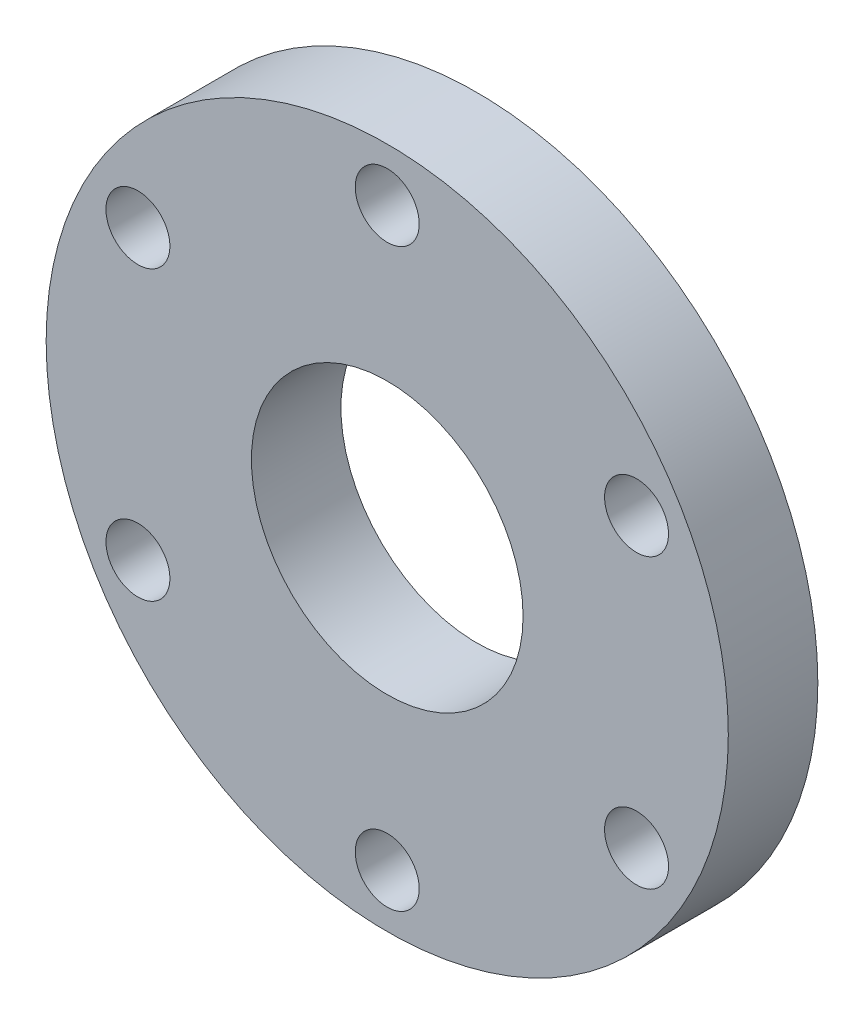
ISO-10303-21;
HEADER;
FILE_DESCRIPTION(('STEP AP214'),'2;1');
FILE_NAME('part.step','',(''),(''),'','','');
FILE_SCHEMA(('AUTOMOTIVE_DESIGN { 1 0 10303 214 1 1 1 1 }'));
ENDSEC;
DATA;
#1=APPLICATION_CONTEXT('core data for automotive mechanical design processes');
#2=APPLICATION_PROTOCOL_DEFINITION('international standard','automotive_design',2000,#1);
#3=PRODUCT_CONTEXT('',#1,'mechanical');
#4=PRODUCT('Part','Part','',(#3));
#5=PRODUCT_RELATED_PRODUCT_CATEGORY('part','',(#4));
#6=PRODUCT_DEFINITION_FORMATION('','',#4);
#7=PRODUCT_DEFINITION_CONTEXT('part definition',#1,'design');
#8=PRODUCT_DEFINITION('design','',#6,#7);
#9=PRODUCT_DEFINITION_SHAPE('','',#8);
#10=(LENGTH_UNIT() NAMED_UNIT(*) SI_UNIT(.MILLI.,.METRE.));
#11=(NAMED_UNIT(*) PLANE_ANGLE_UNIT() SI_UNIT($,.RADIAN.));
#12=(NAMED_UNIT(*) SI_UNIT($,.STERADIAN.) SOLID_ANGLE_UNIT());
#13=UNCERTAINTY_MEASURE_WITH_UNIT(LENGTH_MEASURE(1.E-05),#10,'distance_accuracy_value','');
#14=(GEOMETRIC_REPRESENTATION_CONTEXT(3) GLOBAL_UNCERTAINTY_ASSIGNED_CONTEXT((#13)) GLOBAL_UNIT_ASSIGNED_CONTEXT((#10,
#11,#12)) REPRESENTATION_CONTEXT('',''));
#15=CARTESIAN_POINT('',(0.,0.,0.));
#16=DIRECTION('',(0.,0.,1.));
#17=DIRECTION('',(1.,0.,0.));
#18=AXIS2_PLACEMENT_3D('',#15,#16,#17);
#19=CARTESIAN_POINT('',(0.,0.,6.6675));
#20=DIRECTION('',(0.,0.,-1.));
#21=DIRECTION('',(-1.,0.,0.));
#22=AXIS2_PLACEMENT_3D('',#19,#20,#21);
#23=CYLINDRICAL_SURFACE('',#22,50.8);
#24=CARTESIAN_POINT('',(0.,0.,6.6675));
#25=DIRECTION('',(0.,0.,1.));
#26=DIRECTION('',(1.,0.,0.));
#27=AXIS2_PLACEMENT_3D('',#24,#25,#26);
#28=CIRCLE('',#27,50.8);
#29=CARTESIAN_POINT('',(50.8,0.,6.6675));
#30=VERTEX_POINT('',#29);
#31=EDGE_CURVE('E10',#30,#30,#28,.T.);
#32=ORIENTED_EDGE('',*,*,#31,.F.);
#33=EDGE_LOOP('',(#32));
#34=FACE_BOUND('',#33,.T.);
#35=CARTESIAN_POINT('',(0.,0.,-6.6675));
#36=DIRECTION('',(0.,0.,1.));
#37=DIRECTION('',(1.,0.,0.));
#38=AXIS2_PLACEMENT_3D('',#35,#36,#37);
#39=CIRCLE('',#38,50.8);
#40=CARTESIAN_POINT('',(50.8,0.,-6.6675));
#41=VERTEX_POINT('',#40);
#42=EDGE_CURVE('E43',#41,#41,#39,.T.);
#43=ORIENTED_EDGE('',*,*,#42,.T.);
#44=EDGE_LOOP('',(#43));
#45=FACE_BOUND('',#44,.T.);
#46=ADVANCED_FACE('F40',(#34,#45),#23,.T.);
#47=CARTESIAN_POINT('',(0.,0.,6.6675));
#48=DIRECTION('',(0.,0.,1.));
#49=DIRECTION('',(1.,0.,0.));
#50=AXIS2_PLACEMENT_3D('',#47,#48,#49);
#51=PLANE('',#50);
#52=CARTESIAN_POINT('',(37.1310123923383,21.4376000000004,6.6675));
#53=DIRECTION('',(0.,0.,1.));
#54=DIRECTION('',(0.50000000000001,-0.866025403784433,0.));
#55=AXIS2_PLACEMENT_3D('',#52,#53,#54);
#56=CIRCLE('',#55,4.7625);
#57=CARTESIAN_POINT('',(39.5122623923384,17.3131540144771,6.6675));
#58=VERTEX_POINT('',#57);
#59=EDGE_CURVE('E78',#58,#58,#56,.T.);
#60=ORIENTED_EDGE('',*,*,#59,.F.);
#61=EDGE_LOOP('',(#60));
#62=FACE_BOUND('',#61,.T.);
#63=CARTESIAN_POINT('',(37.1310123923388,-21.4375999999997,6.6675));
#64=DIRECTION('',(0.,0.,1.));
#65=DIRECTION('',(-0.499999999999992,-0.866025403784443,0.));
#66=AXIS2_PLACEMENT_3D('',#63,#64,#65);
#67=CIRCLE('',#66,4.7625);
#68=CARTESIAN_POINT('',(34.7497623923388,-25.5620459855231,6.6675));
#69=VERTEX_POINT('',#68);
#70=EDGE_CURVE('E86',#69,#69,#67,.T.);
#71=ORIENTED_EDGE('',*,*,#70,.F.);
#72=EDGE_LOOP('',(#71));
#73=FACE_BOUND('',#72,.T.);
#74=CARTESIAN_POINT('',(0.,-42.8752,6.6675));
#75=DIRECTION('',(0.,0.,1.));
#76=DIRECTION('',(-1.,0.,0.));
#77=AXIS2_PLACEMENT_3D('',#74,#75,#76);
#78=CIRCLE('',#77,4.7625);
#79=CARTESIAN_POINT('',(-4.7625,-42.8752,6.6675));
#80=VERTEX_POINT('',#79);
#81=EDGE_CURVE('E94',#80,#80,#78,.T.);
#82=ORIENTED_EDGE('',*,*,#81,.F.);
#83=EDGE_LOOP('',(#82));
#84=FACE_BOUND('',#83,.T.);
#85=CARTESIAN_POINT('',(-37.1310123923385,-21.4376000000002,6.6675));
#86=DIRECTION('',(0.,0.,1.));
#87=DIRECTION('',(-0.500000000000004,0.866025403784436,0.));
#88=AXIS2_PLACEMENT_3D('',#85,#86,#87);
#89=CIRCLE('',#88,4.7625);
#90=CARTESIAN_POINT('',(-39.5122623923385,-17.3131540144768,6.6675));
#91=VERTEX_POINT('',#90);
#92=EDGE_CURVE('E102',#91,#91,#89,.T.);
#93=ORIENTED_EDGE('',*,*,#92,.F.);
#94=EDGE_LOOP('',(#93));
#95=FACE_BOUND('',#94,.T.);
#96=CARTESIAN_POINT('',(-37.1310123923386,21.4375999999999,6.6675));
#97=DIRECTION('',(0.,0.,1.));
#98=DIRECTION('',(0.499999999999998,0.86602540378444,0.));
#99=AXIS2_PLACEMENT_3D('',#96,#97,#98);
#100=CIRCLE('',#99,4.7625);
#101=CARTESIAN_POINT('',(-34.7497623923386,25.5620459855233,6.6675));
#102=VERTEX_POINT('',#101);
#103=EDGE_CURVE('E70',#102,#102,#100,.T.);
#104=ORIENTED_EDGE('',*,*,#103,.F.);
#105=EDGE_LOOP('',(#104));
#106=FACE_BOUND('',#105,.T.);
#107=CARTESIAN_POINT('',(0.,42.8752,6.6675));
#108=DIRECTION('',(0.,0.,1.));
#109=DIRECTION('',(1.,0.,0.));
#110=AXIS2_PLACEMENT_3D('',#107,#108,#109);
#111=CIRCLE('',#110,4.7625);
#112=CARTESIAN_POINT('',(4.7625,42.8752,6.6675));
#113=VERTEX_POINT('',#112);
#114=EDGE_CURVE('E62',#113,#113,#111,.T.);
#115=ORIENTED_EDGE('',*,*,#114,.F.);
#116=EDGE_LOOP('',(#115));
#117=FACE_BOUND('',#116,.T.);
#118=CARTESIAN_POINT('',(0.,0.,6.6675));
#119=DIRECTION('',(0.,0.,1.));
#120=DIRECTION('',(1.,0.,0.));
#121=AXIS2_PLACEMENT_3D('',#118,#119,#120);
#122=CIRCLE('',#121,20.2311);
#123=CARTESIAN_POINT('',(20.2311,0.,6.6675));
#124=VERTEX_POINT('',#123);
#125=EDGE_CURVE('E54',#124,#124,#122,.T.);
#126=ORIENTED_EDGE('',*,*,#125,.F.);
#127=EDGE_LOOP('',(#126));
#128=FACE_BOUND('',#127,.T.);
#129=ORIENTED_EDGE('',*,*,#31,.T.);
#130=EDGE_LOOP('',(#129));
#131=FACE_BOUND('',#130,.T.);
#132=ADVANCED_FACE('F121',(#62,#73,#84,#95,#106,#117,#128,#131),#51,.T.);
#133=CARTESIAN_POINT('',(0.,0.,-6.6675));
#134=DIRECTION('',(0.,0.,1.));
#135=DIRECTION('',(1.,0.,0.));
#136=AXIS2_PLACEMENT_3D('',#133,#134,#135);
#137=PLANE('',#136);
#138=CARTESIAN_POINT('',(37.1310123923383,21.4376000000004,-6.6675));
#139=DIRECTION('',(0.,0.,1.));
#140=DIRECTION('',(0.50000000000001,-0.866025403784433,0.));
#141=AXIS2_PLACEMENT_3D('',#138,#139,#140);
#142=CIRCLE('',#141,4.7625);
#143=CARTESIAN_POINT('',(39.5122623923384,17.3131540144771,-6.6675));
#144=VERTEX_POINT('',#143);
#145=EDGE_CURVE('E82',#144,#144,#142,.T.);
#146=ORIENTED_EDGE('',*,*,#145,.T.);
#147=EDGE_LOOP('',(#146));
#148=FACE_BOUND('',#147,.T.);
#149=CARTESIAN_POINT('',(37.1310123923388,-21.4375999999997,-6.6675));
#150=DIRECTION('',(0.,0.,1.));
#151=DIRECTION('',(-0.499999999999992,-0.866025403784443,0.));
#152=AXIS2_PLACEMENT_3D('',#149,#150,#151);
#153=CIRCLE('',#152,4.7625);
#154=CARTESIAN_POINT('',(34.7497623923388,-25.5620459855231,-6.6675));
#155=VERTEX_POINT('',#154);
#156=EDGE_CURVE('E90',#155,#155,#153,.T.);
#157=ORIENTED_EDGE('',*,*,#156,.T.);
#158=EDGE_LOOP('',(#157));
#159=FACE_BOUND('',#158,.T.);
#160=CARTESIAN_POINT('',(0.,-42.8752,-6.6675));
#161=DIRECTION('',(0.,0.,1.));
#162=DIRECTION('',(-1.,0.,0.));
#163=AXIS2_PLACEMENT_3D('',#160,#161,#162);
#164=CIRCLE('',#163,4.7625);
#165=CARTESIAN_POINT('',(-4.7625,-42.8752,-6.6675));
#166=VERTEX_POINT('',#165);
#167=EDGE_CURVE('E98',#166,#166,#164,.T.);
#168=ORIENTED_EDGE('',*,*,#167,.T.);
#169=EDGE_LOOP('',(#168));
#170=FACE_BOUND('',#169,.T.);
#171=CARTESIAN_POINT('',(-37.1310123923385,-21.4376000000002,-6.6675));
#172=DIRECTION('',(0.,0.,1.));
#173=DIRECTION('',(-0.500000000000004,0.866025403784436,0.));
#174=AXIS2_PLACEMENT_3D('',#171,#172,#173);
#175=CIRCLE('',#174,4.7625);
#176=CARTESIAN_POINT('',(-39.5122623923385,-17.3131540144768,-6.6675));
#177=VERTEX_POINT('',#176);
#178=EDGE_CURVE('E74',#177,#177,#175,.T.);
#179=ORIENTED_EDGE('',*,*,#178,.T.);
#180=EDGE_LOOP('',(#179));
#181=FACE_BOUND('',#180,.T.);
#182=CARTESIAN_POINT('',(-37.1310123923386,21.4375999999999,-6.6675));
#183=DIRECTION('',(0.,0.,1.));
#184=DIRECTION('',(0.499999999999998,0.86602540378444,0.));
#185=AXIS2_PLACEMENT_3D('',#182,#183,#184);
#186=CIRCLE('',#185,4.7625);
#187=CARTESIAN_POINT('',(-34.7497623923386,25.5620459855233,-6.6675));
#188=VERTEX_POINT('',#187);
#189=EDGE_CURVE('E66',#188,#188,#186,.T.);
#190=ORIENTED_EDGE('',*,*,#189,.T.);
#191=EDGE_LOOP('',(#190));
#192=FACE_BOUND('',#191,.T.);
#193=CARTESIAN_POINT('',(0.,42.8752,-6.6675));
#194=DIRECTION('',(0.,0.,1.));
#195=DIRECTION('',(1.,0.,0.));
#196=AXIS2_PLACEMENT_3D('',#193,#194,#195);
#197=CIRCLE('',#196,4.7625);
#198=CARTESIAN_POINT('',(4.7625,42.8752,-6.6675));
#199=VERTEX_POINT('',#198);
#200=EDGE_CURVE('E58',#199,#199,#197,.T.);
#201=ORIENTED_EDGE('',*,*,#200,.T.);
#202=EDGE_LOOP('',(#201));
#203=FACE_BOUND('',#202,.T.);
#204=CARTESIAN_POINT('',(0.,0.,-6.6675));
#205=DIRECTION('',(0.,0.,1.));
#206=DIRECTION('',(1.,0.,0.));
#207=AXIS2_PLACEMENT_3D('',#204,#205,#206);
#208=CIRCLE('',#207,20.2311);
#209=CARTESIAN_POINT('',(20.2311,0.,-6.6675));
#210=VERTEX_POINT('',#209);
#211=EDGE_CURVE('E52',#210,#210,#208,.T.);
#212=ORIENTED_EDGE('',*,*,#211,.T.);
#213=EDGE_LOOP('',(#212));
#214=FACE_BOUND('',#213,.T.);
#215=ORIENTED_EDGE('',*,*,#42,.F.);
#216=EDGE_LOOP('',(#215));
#217=FACE_BOUND('',#216,.T.);
#218=ADVANCED_FACE('F110',(#148,#159,#170,#181,#192,#203,#214,#217),#137,.F.);
#219=CARTESIAN_POINT('',(0.,0.,-6.6675));
#220=DIRECTION('',(0.,0.,1.));
#221=DIRECTION('',(1.,0.,0.));
#222=AXIS2_PLACEMENT_3D('',#219,#220,#221);
#223=CYLINDRICAL_SURFACE('',#222,20.2311);
#224=ORIENTED_EDGE('',*,*,#211,.F.);
#225=EDGE_LOOP('',(#224));
#226=FACE_BOUND('',#225,.T.);
#227=ORIENTED_EDGE('',*,*,#125,.T.);
#228=EDGE_LOOP('',(#227));
#229=FACE_BOUND('',#228,.T.);
#230=ADVANCED_FACE('F132',(#226,#229),#223,.F.);
#231=CARTESIAN_POINT('',(0.,42.8752,-6.6675));
#232=DIRECTION('',(0.,0.,1.));
#233=DIRECTION('',(1.,0.,0.));
#234=AXIS2_PLACEMENT_3D('',#231,#232,#233);
#235=CYLINDRICAL_SURFACE('',#234,4.7625);
#236=ORIENTED_EDGE('',*,*,#200,.F.);
#237=EDGE_LOOP('',(#236));
#238=FACE_BOUND('',#237,.T.);
#239=ORIENTED_EDGE('',*,*,#114,.T.);
#240=EDGE_LOOP('',(#239));
#241=FACE_BOUND('',#240,.T.);
#242=ADVANCED_FACE('F134',(#238,#241),#235,.F.);
#243=CARTESIAN_POINT('',(-37.1310123923386,21.4375999999999,-6.6675));
#244=DIRECTION('',(0.,0.,1.));
#245=DIRECTION('',(1.,0.,0.));
#246=AXIS2_PLACEMENT_3D('',#243,#244,#245);
#247=CYLINDRICAL_SURFACE('',#246,4.7625);
#248=ORIENTED_EDGE('',*,*,#189,.F.);
#249=EDGE_LOOP('',(#248));
#250=FACE_BOUND('',#249,.T.);
#251=ORIENTED_EDGE('',*,*,#103,.T.);
#252=EDGE_LOOP('',(#251));
#253=FACE_BOUND('',#252,.T.);
#254=ADVANCED_FACE('F117',(#250,#253),#247,.F.);
#255=CARTESIAN_POINT('',(-37.1310123923385,-21.4376000000002,-6.6675));
#256=DIRECTION('',(0.,0.,1.));
#257=DIRECTION('',(1.,0.,0.));
#258=AXIS2_PLACEMENT_3D('',#255,#256,#257);
#259=CYLINDRICAL_SURFACE('',#258,4.7625);
#260=ORIENTED_EDGE('',*,*,#178,.F.);
#261=EDGE_LOOP('',(#260));
#262=FACE_BOUND('',#261,.T.);
#263=ORIENTED_EDGE('',*,*,#92,.T.);
#264=EDGE_LOOP('',(#263));
#265=FACE_BOUND('',#264,.T.);
#266=ADVANCED_FACE('F113',(#262,#265),#259,.F.);
#267=CARTESIAN_POINT('',(0.,-42.8752,-6.6675));
#268=DIRECTION('',(0.,0.,1.));
#269=DIRECTION('',(1.,0.,0.));
#270=AXIS2_PLACEMENT_3D('',#267,#268,#269);
#271=CYLINDRICAL_SURFACE('',#270,4.7625);
#272=ORIENTED_EDGE('',*,*,#167,.F.);
#273=EDGE_LOOP('',(#272));
#274=FACE_BOUND('',#273,.T.);
#275=ORIENTED_EDGE('',*,*,#81,.T.);
#276=EDGE_LOOP('',(#275));
#277=FACE_BOUND('',#276,.T.);
#278=ADVANCED_FACE('F116',(#274,#277),#271,.F.);
#279=CARTESIAN_POINT('',(37.1310123923388,-21.4375999999997,-6.6675));
#280=DIRECTION('',(0.,0.,1.));
#281=DIRECTION('',(1.,0.,0.));
#282=AXIS2_PLACEMENT_3D('',#279,#280,#281);
#283=CYLINDRICAL_SURFACE('',#282,4.7625);
#284=ORIENTED_EDGE('',*,*,#156,.F.);
#285=EDGE_LOOP('',(#284));
#286=FACE_BOUND('',#285,.T.);
#287=ORIENTED_EDGE('',*,*,#70,.T.);
#288=EDGE_LOOP('',(#287));
#289=FACE_BOUND('',#288,.T.);
#290=ADVANCED_FACE('F190',(#286,#289),#283,.F.);
#291=CARTESIAN_POINT('',(37.1310123923383,21.4376000000004,-6.6675));
#292=DIRECTION('',(0.,0.,1.));
#293=DIRECTION('',(1.,0.,0.));
#294=AXIS2_PLACEMENT_3D('',#291,#292,#293);
#295=CYLINDRICAL_SURFACE('',#294,4.7625);
#296=ORIENTED_EDGE('',*,*,#145,.F.);
#297=EDGE_LOOP('',(#296));
#298=FACE_BOUND('',#297,.T.);
#299=ORIENTED_EDGE('',*,*,#59,.T.);
#300=EDGE_LOOP('',(#299));
#301=FACE_BOUND('',#300,.T.);
#302=ADVANCED_FACE('F201',(#298,#301),#295,.F.);
#303=CLOSED_SHELL('',(#46,#132,#218,#230,#242,#254,#266,#278,#290,#302));
#304=MANIFOLD_SOLID_BREP('B2',#303);
#305=ADVANCED_BREP_SHAPE_REPRESENTATION('',(#18,#304),#14);
#306=SHAPE_DEFINITION_REPRESENTATION(#9,#305);
ENDSEC;
END-ISO-10303-21;
